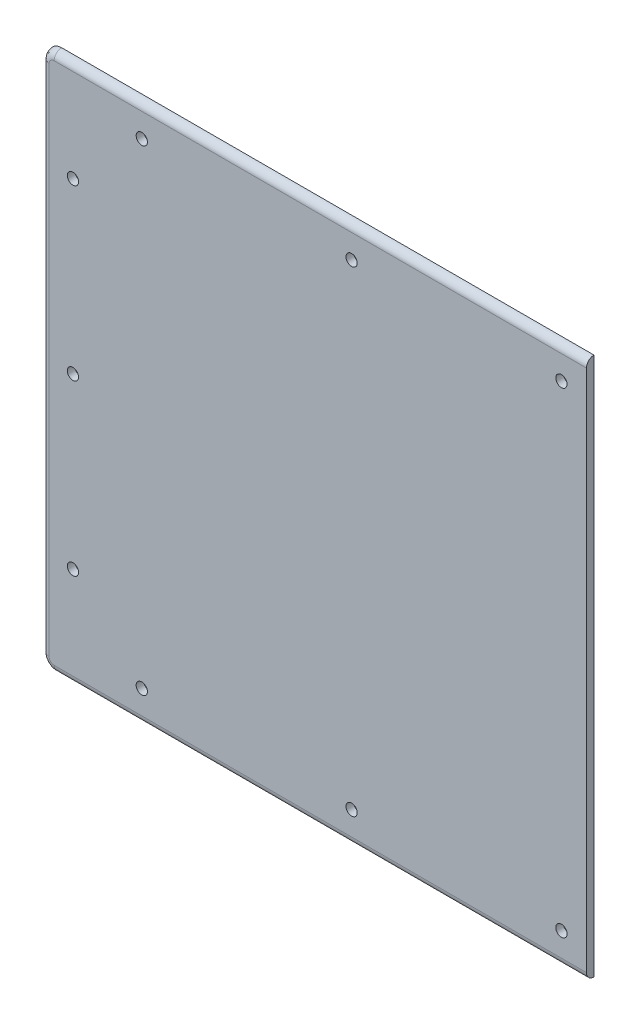
ISO-10303-21;
HEADER;
FILE_DESCRIPTION(('STEP AP214'),'2;1');
FILE_NAME('part.step','',(''),(''),'','','');
FILE_SCHEMA(('AUTOMOTIVE_DESIGN { 1 0 10303 214 1 1 1 1 }'));
ENDSEC;
DATA;
#1=APPLICATION_CONTEXT('core data for automotive mechanical design processes');
#2=APPLICATION_PROTOCOL_DEFINITION('international standard','automotive_design',2000,#1);
#3=PRODUCT_CONTEXT('',#1,'mechanical');
#4=PRODUCT('Part','Part','',(#3));
#5=PRODUCT_RELATED_PRODUCT_CATEGORY('part','',(#4));
#6=PRODUCT_DEFINITION_FORMATION('','',#4);
#7=PRODUCT_DEFINITION_CONTEXT('part definition',#1,'design');
#8=PRODUCT_DEFINITION('design','',#6,#7);
#9=PRODUCT_DEFINITION_SHAPE('','',#8);
#10=(LENGTH_UNIT() NAMED_UNIT(*) SI_UNIT(.MILLI.,.METRE.));
#11=(NAMED_UNIT(*) PLANE_ANGLE_UNIT() SI_UNIT($,.RADIAN.));
#12=(NAMED_UNIT(*) SI_UNIT($,.STERADIAN.) SOLID_ANGLE_UNIT());
#13=UNCERTAINTY_MEASURE_WITH_UNIT(LENGTH_MEASURE(1.E-05),#10,'distance_accuracy_value','');
#14=(GEOMETRIC_REPRESENTATION_CONTEXT(3) GLOBAL_UNCERTAINTY_ASSIGNED_CONTEXT((#13)) GLOBAL_UNIT_ASSIGNED_CONTEXT((#10,
#11,#12)) REPRESENTATION_CONTEXT('',''));
#15=CARTESIAN_POINT('',(0.,0.,0.));
#16=DIRECTION('',(0.,0.,1.));
#17=DIRECTION('',(1.,0.,0.));
#18=AXIS2_PLACEMENT_3D('',#15,#16,#17);
#19=CARTESIAN_POINT('',(108.75,107.5,0.));
#20=DIRECTION('',(0.,0.,1.));
#21=DIRECTION('',(1.,0.,0.));
#22=AXIS2_PLACEMENT_3D('',#19,#20,#21);
#23=PLANE('',#22);
#24=CARTESIAN_POINT('',(12.5,107.5,0.));
#25=DIRECTION('',(0.,0.,-1.));
#26=DIRECTION('',(1.,0.,0.));
#27=AXIS2_PLACEMENT_3D('',#24,#25,#26);
#28=CIRCLE('',#27,2.25);
#29=CARTESIAN_POINT('',(10.25,107.5,0.));
#30=VERTEX_POINT('',#29);
#31=EDGE_CURVE('E226',#30,#30,#28,.T.);
#32=ORIENTED_EDGE('',*,*,#31,.F.);
#33=EDGE_LOOP('',(#32));
#34=FACE_BOUND('',#33,.T.);
#35=CARTESIAN_POINT('',(123.75,12.5,0.));
#36=DIRECTION('',(0.,0.,-1.));
#37=DIRECTION('',(1.,0.,0.));
#38=AXIS2_PLACEMENT_3D('',#35,#36,#37);
#39=CIRCLE('',#38,2.25);
#40=CARTESIAN_POINT('',(121.5,12.5,0.));
#41=VERTEX_POINT('',#40);
#42=EDGE_CURVE('E266',#41,#41,#39,.T.);
#43=ORIENTED_EDGE('',*,*,#42,.F.);
#44=EDGE_LOOP('',(#43));
#45=FACE_BOUND('',#44,.T.);
#46=CARTESIAN_POINT('',(12.5,175.,0.));
#47=DIRECTION('',(0.,0.,-1.));
#48=DIRECTION('',(1.,0.,0.));
#49=AXIS2_PLACEMENT_3D('',#46,#47,#48);
#50=CIRCLE('',#49,2.25);
#51=CARTESIAN_POINT('',(10.25,175.,0.));
#52=VERTEX_POINT('',#51);
#53=EDGE_CURVE('E188',#52,#52,#50,.T.);
#54=ORIENTED_EDGE('',*,*,#53,.F.);
#55=EDGE_LOOP('',(#54));
#56=FACE_BOUND('',#55,.T.);
#57=CARTESIAN_POINT('',(12.5,40.,0.));
#58=DIRECTION('',(0.,0.,-1.));
#59=DIRECTION('',(1.,0.,0.));
#60=AXIS2_PLACEMENT_3D('',#57,#58,#59);
#61=CIRCLE('',#60,2.25);
#62=CARTESIAN_POINT('',(10.25,40.,0.));
#63=VERTEX_POINT('',#62);
#64=EDGE_CURVE('E173',#63,#63,#61,.T.);
#65=ORIENTED_EDGE('',*,*,#64,.F.);
#66=EDGE_LOOP('',(#65));
#67=FACE_BOUND('',#66,.T.);
#68=CARTESIAN_POINT('',(40.,12.5,0.));
#69=DIRECTION('',(0.,0.,-1.));
#70=DIRECTION('',(1.,0.,0.));
#71=AXIS2_PLACEMENT_3D('',#68,#69,#70);
#72=CIRCLE('',#71,2.25);
#73=CARTESIAN_POINT('',(37.75,12.5,0.));
#74=VERTEX_POINT('',#73);
#75=EDGE_CURVE('E187',#74,#74,#72,.T.);
#76=ORIENTED_EDGE('',*,*,#75,.F.);
#77=EDGE_LOOP('',(#76));
#78=FACE_BOUND('',#77,.T.);
#79=CARTESIAN_POINT('',(123.75,202.5,0.));
#80=DIRECTION('',(0.,0.,-1.));
#81=DIRECTION('',(1.,0.,0.));
#82=AXIS2_PLACEMENT_3D('',#79,#80,#81);
#83=CIRCLE('',#82,2.25);
#84=CARTESIAN_POINT('',(121.5,202.5,0.));
#85=VERTEX_POINT('',#84);
#86=EDGE_CURVE('E193',#85,#85,#83,.T.);
#87=ORIENTED_EDGE('',*,*,#86,.F.);
#88=EDGE_LOOP('',(#87));
#89=FACE_BOUND('',#88,.T.);
#90=CARTESIAN_POINT('',(207.5,202.5,0.));
#91=DIRECTION('',(0.,0.,-1.));
#92=DIRECTION('',(1.,0.,0.));
#93=AXIS2_PLACEMENT_3D('',#90,#91,#92);
#94=CIRCLE('',#93,2.25);
#95=CARTESIAN_POINT('',(205.25,202.5,0.));
#96=VERTEX_POINT('',#95);
#97=EDGE_CURVE('E203',#96,#96,#94,.T.);
#98=ORIENTED_EDGE('',*,*,#97,.F.);
#99=EDGE_LOOP('',(#98));
#100=FACE_BOUND('',#99,.T.);
#101=CARTESIAN_POINT('',(207.5,12.5,0.));
#102=DIRECTION('',(0.,0.,-1.));
#103=DIRECTION('',(1.,0.,0.));
#104=AXIS2_PLACEMENT_3D('',#101,#102,#103);
#105=CIRCLE('',#104,2.25);
#106=CARTESIAN_POINT('',(205.25,12.5,0.));
#107=VERTEX_POINT('',#106);
#108=EDGE_CURVE('E246',#107,#107,#105,.T.);
#109=ORIENTED_EDGE('',*,*,#108,.F.);
#110=EDGE_LOOP('',(#109));
#111=FACE_BOUND('',#110,.T.);
#112=CARTESIAN_POINT('',(40.,202.5,0.));
#113=DIRECTION('',(0.,0.,-1.));
#114=DIRECTION('',(1.,0.,0.));
#115=AXIS2_PLACEMENT_3D('',#112,#113,#114);
#116=CIRCLE('',#115,2.25);
#117=CARTESIAN_POINT('',(37.75,202.5,0.));
#118=VERTEX_POINT('',#117);
#119=EDGE_CURVE('E26',#118,#118,#116,.T.);
#120=ORIENTED_EDGE('',*,*,#119,.F.);
#121=EDGE_LOOP('',(#120));
#122=FACE_BOUND('',#121,.T.);
#123=CARTESIAN_POINT('',(5.,5.,0.));
#124=DIRECTION('',(0.,0.,1.));
#125=DIRECTION('',(-1.,0.,0.));
#126=AXIS2_PLACEMENT_3D('',#123,#124,#125);
#127=CIRCLE('',#126,5.);
#128=CARTESIAN_POINT('',(0.,5.,0.));
#129=VERTEX_POINT('',#128);
#130=CARTESIAN_POINT('',(5.,0.,0.));
#131=VERTEX_POINT('',#130);
#132=EDGE_CURVE('E230',#129,#131,#127,.T.);
#133=ORIENTED_EDGE('',*,*,#132,.F.);
#134=DIRECTION('',(0.,-1.,0.));
#135=VECTOR('',#134,1.);
#136=CARTESIAN_POINT('',(0.,210.,0.));
#137=LINE('',#136,#135);
#138=CARTESIAN_POINT('',(0.,210.,0.));
#139=VERTEX_POINT('',#138);
#140=EDGE_CURVE('E243',#139,#129,#137,.T.);
#141=ORIENTED_EDGE('',*,*,#140,.F.);
#142=CARTESIAN_POINT('',(5.,210.,0.));
#143=DIRECTION('',(0.,0.,1.));
#144=DIRECTION('',(0.,1.,0.));
#145=AXIS2_PLACEMENT_3D('',#142,#143,#144);
#146=CIRCLE('',#145,5.);
#147=CARTESIAN_POINT('',(5.,215.,0.));
#148=VERTEX_POINT('',#147);
#149=EDGE_CURVE('E216',#148,#139,#146,.T.);
#150=ORIENTED_EDGE('',*,*,#149,.F.);
#151=DIRECTION('',(-1.,0.,0.));
#152=VECTOR('',#151,1.);
#153=CARTESIAN_POINT('',(217.5,215.,0.));
#154=LINE('',#153,#152);
#155=CARTESIAN_POINT('',(217.5,215.,0.));
#156=VERTEX_POINT('',#155);
#157=EDGE_CURVE('E251',#156,#148,#154,.T.);
#158=ORIENTED_EDGE('',*,*,#157,.F.);
#159=DIRECTION('',(0.,1.,0.));
#160=VECTOR('',#159,1.);
#161=CARTESIAN_POINT('',(217.5,0.,0.));
#162=LINE('',#161,#160);
#163=CARTESIAN_POINT('',(217.5,0.,0.));
#164=VERTEX_POINT('',#163);
#165=EDGE_CURVE('E10',#164,#156,#162,.T.);
#166=ORIENTED_EDGE('',*,*,#165,.F.);
#167=DIRECTION('',(1.,0.,0.));
#168=VECTOR('',#167,1.);
#169=CARTESIAN_POINT('',(5.,0.,0.));
#170=LINE('',#169,#168);
#171=EDGE_CURVE('E258',#131,#164,#170,.T.);
#172=ORIENTED_EDGE('',*,*,#171,.F.);
#173=EDGE_LOOP('',(#133,#141,#150,#158,#166,#172));
#174=FACE_BOUND('',#173,.T.);
#175=ADVANCED_FACE('F15',(#34,#45,#56,#67,#78,#89,#100,#111,#122,#174),#23,.F.);
#176=CARTESIAN_POINT('',(217.5,0.,0.));
#177=DIRECTION('',(1.,0.,0.));
#178=DIRECTION('',(0.,1.,0.));
#179=AXIS2_PLACEMENT_3D('',#176,#177,#178);
#180=PLANE('',#179);
#181=CARTESIAN_POINT('',(217.5,212.,0.));
#182=DIRECTION('',(-1.,0.,0.));
#183=DIRECTION('',(0.,0.707106781186553,0.707106781186543));
#184=AXIS2_PLACEMENT_3D('',#181,#182,#183);
#185=CIRCLE('',#184,3.);
#186=CARTESIAN_POINT('',(217.5,212.,3.));
#187=VERTEX_POINT('',#186);
#188=EDGE_CURVE('E247',#187,#156,#185,.T.);
#189=ORIENTED_EDGE('',*,*,#188,.F.);
#190=DIRECTION('',(0.,1.,0.));
#191=VECTOR('',#190,1.);
#192=CARTESIAN_POINT('',(217.5,0.,3.));
#193=LINE('',#192,#191);
#194=CARTESIAN_POINT('',(217.5,3.,3.));
#195=VERTEX_POINT('',#194);
#196=EDGE_CURVE('E101',#195,#187,#193,.T.);
#197=ORIENTED_EDGE('',*,*,#196,.F.);
#198=CARTESIAN_POINT('',(217.5,3.,0.));
#199=DIRECTION('',(-1.,0.,0.));
#200=DIRECTION('',(0.,-0.707106781186547,0.707106781186548));
#201=AXIS2_PLACEMENT_3D('',#198,#199,#200);
#202=CIRCLE('',#201,3.);
#203=EDGE_CURVE('E259',#164,#195,#202,.T.);
#204=ORIENTED_EDGE('',*,*,#203,.F.);
#205=ORIENTED_EDGE('',*,*,#165,.T.);
#206=EDGE_LOOP('',(#189,#197,#204,#205));
#207=FACE_BOUND('',#206,.T.);
#208=ADVANCED_FACE('F392',(#207),#180,.T.);
#209=CARTESIAN_POINT('',(40.,202.5,0.));
#210=DIRECTION('',(0.,0.,1.));
#211=DIRECTION('',(1.,0.,0.));
#212=AXIS2_PLACEMENT_3D('',#209,#210,#211);
#213=CYLINDRICAL_SURFACE('',#212,2.25);
#214=CARTESIAN_POINT('',(40.,202.5,3.));
#215=DIRECTION('',(0.,0.,-1.));
#216=DIRECTION('',(1.,0.,0.));
#217=AXIS2_PLACEMENT_3D('',#214,#215,#216);
#218=CIRCLE('',#217,2.25);
#219=CARTESIAN_POINT('',(37.75,202.5,3.));
#220=VERTEX_POINT('',#219);
#221=EDGE_CURVE('E214',#220,#220,#218,.T.);
#222=ORIENTED_EDGE('',*,*,#221,.F.);
#223=DIRECTION('',(0.,0.,-1.));
#224=VECTOR('',#223,1.);
#225=CARTESIAN_POINT('',(37.75,202.5,0.));
#226=LINE('',#225,#224);
#227=EDGE_CURVE('E56',#220,#118,#226,.T.);
#228=ORIENTED_EDGE('',*,*,#227,.T.);
#229=ORIENTED_EDGE('',*,*,#119,.T.);
#230=ORIENTED_EDGE('',*,*,#227,.F.);
#231=EDGE_LOOP('',(#222,#228,#229,#230));
#232=FACE_BOUND('',#231,.T.);
#233=ADVANCED_FACE('F405',(#232),#213,.F.);
#234=CARTESIAN_POINT('',(207.5,12.5,0.));
#235=DIRECTION('',(0.,0.,1.));
#236=DIRECTION('',(1.,0.,0.));
#237=AXIS2_PLACEMENT_3D('',#234,#235,#236);
#238=CYLINDRICAL_SURFACE('',#237,2.25);
#239=CARTESIAN_POINT('',(207.5,12.5,3.));
#240=DIRECTION('',(0.,0.,-1.));
#241=DIRECTION('',(1.,0.,0.));
#242=AXIS2_PLACEMENT_3D('',#239,#240,#241);
#243=CIRCLE('',#242,2.25);
#244=CARTESIAN_POINT('',(205.25,12.5,3.));
#245=VERTEX_POINT('',#244);
#246=EDGE_CURVE('E211',#245,#245,#243,.T.);
#247=ORIENTED_EDGE('',*,*,#246,.F.);
#248=DIRECTION('',(0.,0.,-1.));
#249=VECTOR('',#248,1.);
#250=CARTESIAN_POINT('',(205.25,12.5,0.));
#251=LINE('',#250,#249);
#252=EDGE_CURVE('E71',#245,#107,#251,.T.);
#253=ORIENTED_EDGE('',*,*,#252,.T.);
#254=ORIENTED_EDGE('',*,*,#108,.T.);
#255=ORIENTED_EDGE('',*,*,#252,.F.);
#256=EDGE_LOOP('',(#247,#253,#254,#255));
#257=FACE_BOUND('',#256,.T.);
#258=ADVANCED_FACE('F478',(#257),#238,.F.);
#259=CARTESIAN_POINT('',(207.5,202.5,0.));
#260=DIRECTION('',(0.,0.,1.));
#261=DIRECTION('',(1.,0.,0.));
#262=AXIS2_PLACEMENT_3D('',#259,#260,#261);
#263=CYLINDRICAL_SURFACE('',#262,2.25);
#264=CARTESIAN_POINT('',(207.5,202.5,3.));
#265=DIRECTION('',(0.,0.,-1.));
#266=DIRECTION('',(1.,0.,0.));
#267=AXIS2_PLACEMENT_3D('',#264,#265,#266);
#268=CIRCLE('',#267,2.25);
#269=CARTESIAN_POINT('',(205.25,202.5,3.));
#270=VERTEX_POINT('',#269);
#271=EDGE_CURVE('E215',#270,#270,#268,.T.);
#272=ORIENTED_EDGE('',*,*,#271,.F.);
#273=DIRECTION('',(0.,0.,-1.));
#274=VECTOR('',#273,1.);
#275=CARTESIAN_POINT('',(205.25,202.5,0.));
#276=LINE('',#275,#274);
#277=EDGE_CURVE('E196',#270,#96,#276,.T.);
#278=ORIENTED_EDGE('',*,*,#277,.T.);
#279=ORIENTED_EDGE('',*,*,#97,.T.);
#280=ORIENTED_EDGE('',*,*,#277,.F.);
#281=EDGE_LOOP('',(#272,#278,#279,#280));
#282=FACE_BOUND('',#281,.T.);
#283=ADVANCED_FACE('F483',(#282),#263,.F.);
#284=CARTESIAN_POINT('',(123.75,202.5,0.));
#285=DIRECTION('',(0.,0.,1.));
#286=DIRECTION('',(1.,0.,0.));
#287=AXIS2_PLACEMENT_3D('',#284,#285,#286);
#288=CYLINDRICAL_SURFACE('',#287,2.25);
#289=CARTESIAN_POINT('',(123.75,202.5,3.));
#290=DIRECTION('',(0.,0.,-1.));
#291=DIRECTION('',(1.,0.,0.));
#292=AXIS2_PLACEMENT_3D('',#289,#290,#291);
#293=CIRCLE('',#292,2.25);
#294=CARTESIAN_POINT('',(121.5,202.5,3.));
#295=VERTEX_POINT('',#294);
#296=EDGE_CURVE('E236',#295,#295,#293,.T.);
#297=ORIENTED_EDGE('',*,*,#296,.F.);
#298=DIRECTION('',(0.,0.,-1.));
#299=VECTOR('',#298,1.);
#300=CARTESIAN_POINT('',(121.5,202.5,0.));
#301=LINE('',#300,#299);
#302=EDGE_CURVE('E197',#295,#85,#301,.T.);
#303=ORIENTED_EDGE('',*,*,#302,.T.);
#304=ORIENTED_EDGE('',*,*,#86,.T.);
#305=ORIENTED_EDGE('',*,*,#302,.F.);
#306=EDGE_LOOP('',(#297,#303,#304,#305));
#307=FACE_BOUND('',#306,.T.);
#308=ADVANCED_FACE('F505',(#307),#288,.F.);
#309=CARTESIAN_POINT('',(40.,12.5,0.));
#310=DIRECTION('',(0.,0.,1.));
#311=DIRECTION('',(1.,0.,0.));
#312=AXIS2_PLACEMENT_3D('',#309,#310,#311);
#313=CYLINDRICAL_SURFACE('',#312,2.25);
#314=CARTESIAN_POINT('',(40.,12.5,3.));
#315=DIRECTION('',(0.,0.,-1.));
#316=DIRECTION('',(1.,0.,0.));
#317=AXIS2_PLACEMENT_3D('',#314,#315,#316);
#318=CIRCLE('',#317,2.25);
#319=CARTESIAN_POINT('',(37.75,12.5,3.));
#320=VERTEX_POINT('',#319);
#321=EDGE_CURVE('E240',#320,#320,#318,.T.);
#322=ORIENTED_EDGE('',*,*,#321,.F.);
#323=DIRECTION('',(0.,0.,-1.));
#324=VECTOR('',#323,1.);
#325=CARTESIAN_POINT('',(37.75,12.5,0.));
#326=LINE('',#325,#324);
#327=EDGE_CURVE('E19',#320,#74,#326,.T.);
#328=ORIENTED_EDGE('',*,*,#327,.T.);
#329=ORIENTED_EDGE('',*,*,#75,.T.);
#330=ORIENTED_EDGE('',*,*,#327,.F.);
#331=EDGE_LOOP('',(#322,#328,#329,#330));
#332=FACE_BOUND('',#331,.T.);
#333=ADVANCED_FACE('F470',(#332),#313,.F.);
#334=CARTESIAN_POINT('',(12.5,40.,0.));
#335=DIRECTION('',(0.,0.,1.));
#336=DIRECTION('',(1.,0.,0.));
#337=AXIS2_PLACEMENT_3D('',#334,#335,#336);
#338=CYLINDRICAL_SURFACE('',#337,2.25);
#339=CARTESIAN_POINT('',(12.5,40.,3.));
#340=DIRECTION('',(0.,0.,-1.));
#341=DIRECTION('',(1.,0.,0.));
#342=AXIS2_PLACEMENT_3D('',#339,#340,#341);
#343=CIRCLE('',#342,2.25);
#344=CARTESIAN_POINT('',(10.25,40.,3.));
#345=VERTEX_POINT('',#344);
#346=EDGE_CURVE('E282',#345,#345,#343,.T.);
#347=ORIENTED_EDGE('',*,*,#346,.F.);
#348=DIRECTION('',(0.,0.,-1.));
#349=VECTOR('',#348,1.);
#350=CARTESIAN_POINT('',(10.25,40.,0.));
#351=LINE('',#350,#349);
#352=EDGE_CURVE('E176',#345,#63,#351,.T.);
#353=ORIENTED_EDGE('',*,*,#352,.T.);
#354=ORIENTED_EDGE('',*,*,#64,.T.);
#355=ORIENTED_EDGE('',*,*,#352,.F.);
#356=EDGE_LOOP('',(#347,#353,#354,#355));
#357=FACE_BOUND('',#356,.T.);
#358=ADVANCED_FACE('F175',(#357),#338,.F.);
#359=CARTESIAN_POINT('',(12.5,175.,0.));
#360=DIRECTION('',(0.,0.,1.));
#361=DIRECTION('',(1.,0.,0.));
#362=AXIS2_PLACEMENT_3D('',#359,#360,#361);
#363=CYLINDRICAL_SURFACE('',#362,2.25);
#364=CARTESIAN_POINT('',(12.5,175.,3.));
#365=DIRECTION('',(0.,0.,-1.));
#366=DIRECTION('',(1.,0.,0.));
#367=AXIS2_PLACEMENT_3D('',#364,#365,#366);
#368=CIRCLE('',#367,2.25);
#369=CARTESIAN_POINT('',(10.25,175.,3.));
#370=VERTEX_POINT('',#369);
#371=EDGE_CURVE('E273',#370,#370,#368,.T.);
#372=ORIENTED_EDGE('',*,*,#371,.F.);
#373=DIRECTION('',(0.,0.,-1.));
#374=VECTOR('',#373,1.);
#375=CARTESIAN_POINT('',(10.25,175.,0.));
#376=LINE('',#375,#374);
#377=EDGE_CURVE('E287',#370,#52,#376,.T.);
#378=ORIENTED_EDGE('',*,*,#377,.T.);
#379=ORIENTED_EDGE('',*,*,#53,.T.);
#380=ORIENTED_EDGE('',*,*,#377,.F.);
#381=EDGE_LOOP('',(#372,#378,#379,#380));
#382=FACE_BOUND('',#381,.T.);
#383=ADVANCED_FACE('F389',(#382),#363,.F.);
#384=CARTESIAN_POINT('',(123.75,12.5,0.));
#385=DIRECTION('',(0.,0.,1.));
#386=DIRECTION('',(1.,0.,0.));
#387=AXIS2_PLACEMENT_3D('',#384,#385,#386);
#388=CYLINDRICAL_SURFACE('',#387,2.25);
#389=CARTESIAN_POINT('',(123.75,12.5,3.));
#390=DIRECTION('',(0.,0.,-1.));
#391=DIRECTION('',(1.,0.,0.));
#392=AXIS2_PLACEMENT_3D('',#389,#390,#391);
#393=CIRCLE('',#392,2.25);
#394=CARTESIAN_POINT('',(121.5,12.5,3.));
#395=VERTEX_POINT('',#394);
#396=EDGE_CURVE('E202',#395,#395,#393,.T.);
#397=ORIENTED_EDGE('',*,*,#396,.F.);
#398=DIRECTION('',(0.,0.,-1.));
#399=VECTOR('',#398,1.);
#400=CARTESIAN_POINT('',(121.5,12.5,0.));
#401=LINE('',#400,#399);
#402=EDGE_CURVE('E262',#395,#41,#401,.T.);
#403=ORIENTED_EDGE('',*,*,#402,.T.);
#404=ORIENTED_EDGE('',*,*,#42,.T.);
#405=ORIENTED_EDGE('',*,*,#402,.F.);
#406=EDGE_LOOP('',(#397,#403,#404,#405));
#407=FACE_BOUND('',#406,.T.);
#408=ADVANCED_FACE('F496',(#407),#388,.F.);
#409=CARTESIAN_POINT('',(12.5,107.5,0.));
#410=DIRECTION('',(0.,0.,1.));
#411=DIRECTION('',(1.,0.,0.));
#412=AXIS2_PLACEMENT_3D('',#409,#410,#411);
#413=CYLINDRICAL_SURFACE('',#412,2.25);
#414=CARTESIAN_POINT('',(12.5,107.5,3.));
#415=DIRECTION('',(0.,0.,-1.));
#416=DIRECTION('',(1.,0.,0.));
#417=AXIS2_PLACEMENT_3D('',#414,#415,#416);
#418=CIRCLE('',#417,2.25);
#419=CARTESIAN_POINT('',(10.25,107.5,3.));
#420=VERTEX_POINT('',#419);
#421=EDGE_CURVE('E198',#420,#420,#418,.T.);
#422=ORIENTED_EDGE('',*,*,#421,.F.);
#423=DIRECTION('',(0.,0.,-1.));
#424=VECTOR('',#423,1.);
#425=CARTESIAN_POINT('',(10.25,107.5,0.));
#426=LINE('',#425,#424);
#427=EDGE_CURVE('E222',#420,#30,#426,.T.);
#428=ORIENTED_EDGE('',*,*,#427,.T.);
#429=ORIENTED_EDGE('',*,*,#31,.T.);
#430=ORIENTED_EDGE('',*,*,#427,.F.);
#431=EDGE_LOOP('',(#422,#428,#429,#430));
#432=FACE_BOUND('',#431,.T.);
#433=ADVANCED_FACE('F491',(#432),#413,.F.);
#434=CARTESIAN_POINT('',(108.75,107.5,3.));
#435=DIRECTION('',(0.,0.,1.));
#436=DIRECTION('',(1.,0.,0.));
#437=AXIS2_PLACEMENT_3D('',#434,#435,#436);
#438=PLANE('',#437);
#439=ORIENTED_EDGE('',*,*,#221,.T.);
#440=EDGE_LOOP('',(#439));
#441=FACE_BOUND('',#440,.T.);
#442=ORIENTED_EDGE('',*,*,#246,.T.);
#443=EDGE_LOOP('',(#442));
#444=FACE_BOUND('',#443,.T.);
#445=ORIENTED_EDGE('',*,*,#271,.T.);
#446=EDGE_LOOP('',(#445));
#447=FACE_BOUND('',#446,.T.);
#448=ORIENTED_EDGE('',*,*,#296,.T.);
#449=EDGE_LOOP('',(#448));
#450=FACE_BOUND('',#449,.T.);
#451=ORIENTED_EDGE('',*,*,#321,.T.);
#452=EDGE_LOOP('',(#451));
#453=FACE_BOUND('',#452,.T.);
#454=ORIENTED_EDGE('',*,*,#346,.T.);
#455=EDGE_LOOP('',(#454));
#456=FACE_BOUND('',#455,.T.);
#457=ORIENTED_EDGE('',*,*,#371,.T.);
#458=EDGE_LOOP('',(#457));
#459=FACE_BOUND('',#458,.T.);
#460=ORIENTED_EDGE('',*,*,#396,.T.);
#461=EDGE_LOOP('',(#460));
#462=FACE_BOUND('',#461,.T.);
#463=ORIENTED_EDGE('',*,*,#421,.T.);
#464=EDGE_LOOP('',(#463));
#465=FACE_BOUND('',#464,.T.);
#466=DIRECTION('',(1.,0.,0.));
#467=VECTOR('',#466,1.);
#468=CARTESIAN_POINT('',(163.125,212.,3.));
#469=LINE('',#468,#467);
#470=CARTESIAN_POINT('',(5.,212.,3.));
#471=VERTEX_POINT('',#470);
#472=EDGE_CURVE('E221',#471,#187,#469,.T.);
#473=ORIENTED_EDGE('',*,*,#472,.F.);
#474=CARTESIAN_POINT('',(5.,210.,3.));
#475=DIRECTION('',(0.,0.,-1.));
#476=DIRECTION('',(-0.707106781186549,0.707106781186546,0.));
#477=AXIS2_PLACEMENT_3D('',#474,#475,#476);
#478=CIRCLE('',#477,2.);
#479=CARTESIAN_POINT('',(3.,210.,3.));
#480=VERTEX_POINT('',#479);
#481=EDGE_CURVE('E235',#480,#471,#478,.T.);
#482=ORIENTED_EDGE('',*,*,#481,.F.);
#483=DIRECTION('',(0.,1.,0.));
#484=VECTOR('',#483,1.);
#485=CARTESIAN_POINT('',(3.,158.75,3.));
#486=LINE('',#485,#484);
#487=CARTESIAN_POINT('',(3.,5.,3.));
#488=VERTEX_POINT('',#487);
#489=EDGE_CURVE('E227',#488,#480,#486,.T.);
#490=ORIENTED_EDGE('',*,*,#489,.F.);
#491=CARTESIAN_POINT('',(5.,5.,3.));
#492=DIRECTION('',(0.,0.,-1.));
#493=DIRECTION('',(-0.707106781186548,-0.707106781186547,0.));
#494=AXIS2_PLACEMENT_3D('',#491,#492,#493);
#495=CIRCLE('',#494,2.);
#496=CARTESIAN_POINT('',(5.,3.,3.));
#497=VERTEX_POINT('',#496);
#498=EDGE_CURVE('E278',#497,#488,#495,.T.);
#499=ORIENTED_EDGE('',*,*,#498,.F.);
#500=DIRECTION('',(-1.,0.,0.));
#501=VECTOR('',#500,1.);
#502=CARTESIAN_POINT('',(56.875,3.,3.));
#503=LINE('',#502,#501);
#504=EDGE_CURVE('E255',#195,#497,#503,.T.);
#505=ORIENTED_EDGE('',*,*,#504,.F.);
#506=ORIENTED_EDGE('',*,*,#196,.T.);
#507=EDGE_LOOP('',(#473,#482,#490,#499,#505,#506));
#508=FACE_BOUND('',#507,.T.);
#509=ADVANCED_FACE('F315',(#441,#444,#447,#450,#453,#456,#459,#462,#465,#508),#438,.T.);
#510=CARTESIAN_POINT('',(56.875,3.,0.));
#511=DIRECTION('',(1.,0.,0.));
#512=DIRECTION('',(0.,-0.707106781186547,0.707106781186548));
#513=AXIS2_PLACEMENT_3D('',#510,#511,#512);
#514=CYLINDRICAL_SURFACE('',#513,3.);
#515=ORIENTED_EDGE('',*,*,#203,.T.);
#516=ORIENTED_EDGE('',*,*,#504,.T.);
#517=CARTESIAN_POINT('',(5.,3.,0.));
#518=DIRECTION('',(-1.,0.,0.));
#519=DIRECTION('',(0.,-1.,0.));
#520=AXIS2_PLACEMENT_3D('',#517,#518,#519);
#521=CIRCLE('',#520,3.);
#522=EDGE_CURVE('E274',#131,#497,#521,.T.);
#523=ORIENTED_EDGE('',*,*,#522,.F.);
#524=ORIENTED_EDGE('',*,*,#171,.T.);
#525=EDGE_LOOP('',(#515,#516,#523,#524));
#526=FACE_BOUND('',#525,.T.);
#527=ADVANCED_FACE('F312',(#526),#514,.T.);
#528=CARTESIAN_POINT('',(0.,5.,0.));
#529=CARTESIAN_POINT('',(0.,0.,0.));
#530=CARTESIAN_POINT('',(5.,0.,0.));
#531=CARTESIAN_POINT('',(0.,4.99999999999999,3.00000000000001));
#532=CARTESIAN_POINT('',(0.,0.,3.));
#533=CARTESIAN_POINT('',(4.99999999999999,0.,3.00000000000001));
#534=CARTESIAN_POINT('',(3.,5.,3.));
#535=CARTESIAN_POINT('',(3.00000000000001,3.,3.));
#536=CARTESIAN_POINT('',(5.,3.,3.));
#537=(BOUNDED_SURFACE() B_SPLINE_SURFACE(2,2,((#528,#529,#530),(#531,#532,#533),(#534,#535,
#536)),.UNSPECIFIED.,.F.,.F.,.F.) B_SPLINE_SURFACE_WITH_KNOTS((3,3),(3,3),(0.,1.5707963267949),
(-3.14159265358979,-1.5707963267949),
.UNSPECIFIED.) GEOMETRIC_REPRESENTATION_ITEM() RATIONAL_B_SPLINE_SURFACE(((1.,0.707106781186547,
1.),(0.707106781186547,0.5,0.707106781186547),(1.,0.707106781186547,1.))) REPRESENTATION_ITEM('') SURFACE());
#538=CARTESIAN_POINT('',(3.,5.,0.));
#539=DIRECTION('',(0.,1.,0.));
#540=DIRECTION('',(-1.,0.,0.));
#541=AXIS2_PLACEMENT_3D('',#538,#539,#540);
#542=CIRCLE('',#541,3.);
#543=EDGE_CURVE('E231',#129,#488,#542,.T.);
#544=ORIENTED_EDGE('',*,*,#543,.F.);
#545=ORIENTED_EDGE('',*,*,#132,.T.);
#546=ORIENTED_EDGE('',*,*,#522,.T.);
#547=ORIENTED_EDGE('',*,*,#498,.T.);
#548=EDGE_LOOP('',(#544,#545,#546,#547));
#549=FACE_BOUND('',#548,.T.);
#550=ADVANCED_FACE('F305',(#549),#537,.F.);
#551=CARTESIAN_POINT('',(3.,158.75,0.));
#552=DIRECTION('',(0.,-1.,0.));
#553=DIRECTION('',(-0.707106781186548,0.,0.707106781186547));
#554=AXIS2_PLACEMENT_3D('',#551,#552,#553);
#555=CYLINDRICAL_SURFACE('',#554,3.);
#556=CARTESIAN_POINT('',(3.,210.,0.));
#557=DIRECTION('',(0.,1.,0.));
#558=DIRECTION('',(-1.,0.,0.));
#559=AXIS2_PLACEMENT_3D('',#556,#557,#558);
#560=CIRCLE('',#559,3.);
#561=EDGE_CURVE('E220',#139,#480,#560,.T.);
#562=ORIENTED_EDGE('',*,*,#561,.F.);
#563=ORIENTED_EDGE('',*,*,#140,.T.);
#564=ORIENTED_EDGE('',*,*,#543,.T.);
#565=ORIENTED_EDGE('',*,*,#489,.T.);
#566=EDGE_LOOP('',(#562,#563,#564,#565));
#567=FACE_BOUND('',#566,.T.);
#568=ADVANCED_FACE('F17',(#567),#555,.T.);
#569=CARTESIAN_POINT('',(5.,215.,0.));
#570=CARTESIAN_POINT('',(0.,215.,0.));
#571=CARTESIAN_POINT('',(0.,210.,0.));
#572=CARTESIAN_POINT('',(5.00000000000001,215.,3.00000000000001));
#573=CARTESIAN_POINT('',(0.,215.,3.));
#574=CARTESIAN_POINT('',(0.,210.,3.00000000000001));
#575=CARTESIAN_POINT('',(5.,212.,3.));
#576=CARTESIAN_POINT('',(3.00000000000002,212.,3.));
#577=CARTESIAN_POINT('',(3.,210.,3.));
#578=(BOUNDED_SURFACE() B_SPLINE_SURFACE(2,2,((#569,#570,#571),(#572,#573,#574),(#575,#576,
#577)),.UNSPECIFIED.,.F.,.F.,.F.) B_SPLINE_SURFACE_WITH_KNOTS((3,3),(3,3),(0.,1.5707963267949),
(1.5707963267949,3.14159265358979),
.UNSPECIFIED.) GEOMETRIC_REPRESENTATION_ITEM() RATIONAL_B_SPLINE_SURFACE(((1.,0.707106781186548,
1.),(0.707106781186548,0.5,0.707106781186548),(1.,0.707106781186548,1.))) REPRESENTATION_ITEM('') SURFACE());
#579=CARTESIAN_POINT('',(5.,212.,0.));
#580=DIRECTION('',(1.,0.,0.));
#581=DIRECTION('',(0.,1.,0.));
#582=AXIS2_PLACEMENT_3D('',#579,#580,#581);
#583=CIRCLE('',#582,3.);
#584=EDGE_CURVE('E269',#148,#471,#583,.T.);
#585=ORIENTED_EDGE('',*,*,#584,.F.);
#586=ORIENTED_EDGE('',*,*,#149,.T.);
#587=ORIENTED_EDGE('',*,*,#561,.T.);
#588=ORIENTED_EDGE('',*,*,#481,.T.);
#589=EDGE_LOOP('',(#585,#586,#587,#588));
#590=FACE_BOUND('',#589,.T.);
#591=ADVANCED_FACE('F450',(#590),#578,.F.);
#592=CARTESIAN_POINT('',(163.125,212.,0.));
#593=DIRECTION('',(-1.,0.,0.));
#594=DIRECTION('',(0.,0.707106781186553,0.707106781186543));
#595=AXIS2_PLACEMENT_3D('',#592,#593,#594);
#596=CYLINDRICAL_SURFACE('',#595,3.);
#597=ORIENTED_EDGE('',*,*,#188,.T.);
#598=ORIENTED_EDGE('',*,*,#157,.T.);
#599=ORIENTED_EDGE('',*,*,#584,.T.);
#600=ORIENTED_EDGE('',*,*,#472,.T.);
#601=EDGE_LOOP('',(#597,#598,#599,#600));
#602=FACE_BOUND('',#601,.T.);
#603=ADVANCED_FACE('F456',(#602),#596,.T.);
#604=CLOSED_SHELL('',(#175,#208,#233,#258,#283,#308,#333,#358,#383,#408,#433,#509,#527,#550,
#568,#591,#603));
#605=MANIFOLD_SOLID_BREP('B1',#604);
#606=ADVANCED_BREP_SHAPE_REPRESENTATION('',(#18,#605),#14);
#607=SHAPE_DEFINITION_REPRESENTATION(#9,#606);
ENDSEC;
END-ISO-10303-21;
